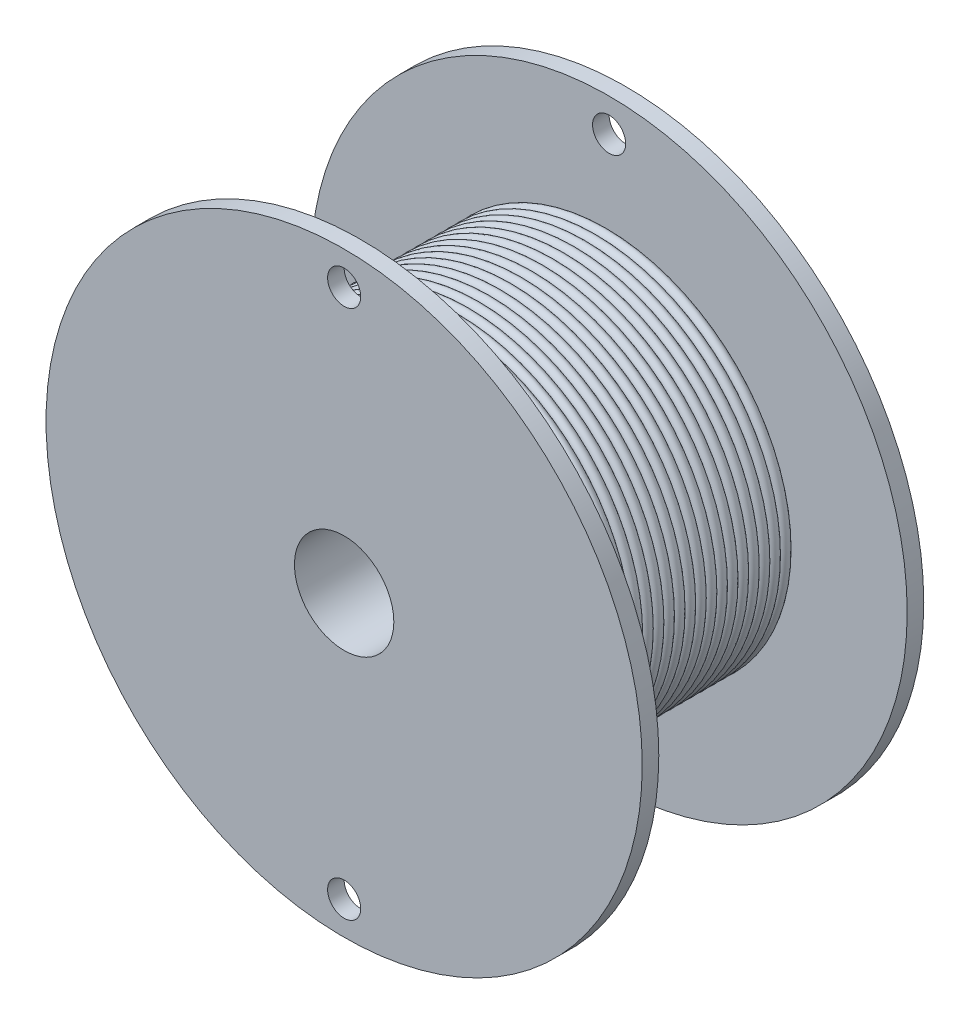
ISO-10303-21;
HEADER;
FILE_DESCRIPTION(('STEP AP214'),'2;1');
FILE_NAME('part.step','',(''),(''),'','','');
FILE_SCHEMA(('AUTOMOTIVE_DESIGN { 1 0 10303 214 1 1 1 1 }'));
ENDSEC;
DATA;
#1=APPLICATION_CONTEXT('core data for automotive mechanical design processes');
#2=APPLICATION_PROTOCOL_DEFINITION('international standard','automotive_design',2000,#1);
#3=PRODUCT_CONTEXT('',#1,'mechanical');
#4=PRODUCT('Part','Part','',(#3));
#5=PRODUCT_RELATED_PRODUCT_CATEGORY('part','',(#4));
#6=PRODUCT_DEFINITION_FORMATION('','',#4);
#7=PRODUCT_DEFINITION_CONTEXT('part definition',#1,'design');
#8=PRODUCT_DEFINITION('design','',#6,#7);
#9=PRODUCT_DEFINITION_SHAPE('','',#8);
#10=(LENGTH_UNIT() NAMED_UNIT(*) SI_UNIT(.MILLI.,.METRE.));
#11=(NAMED_UNIT(*) PLANE_ANGLE_UNIT() SI_UNIT($,.RADIAN.));
#12=(NAMED_UNIT(*) SI_UNIT($,.STERADIAN.) SOLID_ANGLE_UNIT());
#13=UNCERTAINTY_MEASURE_WITH_UNIT(LENGTH_MEASURE(1.E-05),#10,'distance_accuracy_value','');
#14=(GEOMETRIC_REPRESENTATION_CONTEXT(3) GLOBAL_UNCERTAINTY_ASSIGNED_CONTEXT((#13)) GLOBAL_UNIT_ASSIGNED_CONTEXT((#10,
#11,#12)) REPRESENTATION_CONTEXT('',''));
#15=CARTESIAN_POINT('',(0.,0.,0.));
#16=DIRECTION('',(0.,0.,1.));
#17=DIRECTION('',(1.,0.,0.));
#18=AXIS2_PLACEMENT_3D('',#15,#16,#17);
#19=CARTESIAN_POINT('',(0.,0.,-72.9302989836355));
#20=DIRECTION('',(0.,0.,-1.));
#21=DIRECTION('',(-1.,0.,0.));
#22=AXIS2_PLACEMENT_3D('',#19,#20,#21);
#23=TOROIDAL_SURFACE('',#22,54.8417985390266,1.53215312717876);
#24=CARTESIAN_POINT('',(-56.3739516662053,0.,-72.9302989836355));
#25=VERTEX_POINT('',#24);
#26=VERTEX_LOOP('',#25);
#27=FACE_BOUND('',#26,.T.);
#28=ADVANCED_FACE('F39',(#27),#23,.T.);
#29=CLOSED_SHELL('',(#28));
#30=MANIFOLD_SOLID_BREP('B2',#29);
#31=CARTESIAN_POINT('',(0.,0.,-69.7302989836355));
#32=DIRECTION('',(0.,0.,-1.));
#33=DIRECTION('',(-1.,0.,0.));
#34=AXIS2_PLACEMENT_3D('',#31,#32,#33);
#35=TOROIDAL_SURFACE('',#34,54.8417985390266,1.53215312717876);
#36=CARTESIAN_POINT('',(-56.3739516662053,0.,-69.7302989836355));
#37=VERTEX_POINT('',#36);
#38=VERTEX_LOOP('',#37);
#39=FACE_BOUND('',#38,.T.);
#40=ADVANCED_FACE('F57',(#39),#35,.T.);
#41=CLOSED_SHELL('',(#40));
#42=MANIFOLD_SOLID_BREP('B6',#41);
#43=CARTESIAN_POINT('',(0.,0.,-66.5302989836355));
#44=DIRECTION('',(0.,0.,-1.));
#45=DIRECTION('',(-1.,0.,0.));
#46=AXIS2_PLACEMENT_3D('',#43,#44,#45);
#47=TOROIDAL_SURFACE('',#46,54.8417985390266,1.53215312717876);
#48=CARTESIAN_POINT('',(-56.3739516662053,0.,-66.5302989836355));
#49=VERTEX_POINT('',#48);
#50=VERTEX_LOOP('',#49);
#51=FACE_BOUND('',#50,.T.);
#52=ADVANCED_FACE('F75',(#51),#47,.T.);
#53=CLOSED_SHELL('',(#52));
#54=MANIFOLD_SOLID_BREP('B35',#53);
#55=CARTESIAN_POINT('',(0.,0.,-63.3302989836355));
#56=DIRECTION('',(0.,0.,-1.));
#57=DIRECTION('',(-1.,0.,0.));
#58=AXIS2_PLACEMENT_3D('',#55,#56,#57);
#59=TOROIDAL_SURFACE('',#58,54.8417985390266,1.53215312717876);
#60=CARTESIAN_POINT('',(-56.3739516662053,0.,-63.3302989836355));
#61=VERTEX_POINT('',#60);
#62=VERTEX_LOOP('',#61);
#63=FACE_BOUND('',#62,.T.);
#64=ADVANCED_FACE('F93',(#63),#59,.T.);
#65=CLOSED_SHELL('',(#64));
#66=MANIFOLD_SOLID_BREP('B53',#65);
#67=CARTESIAN_POINT('',(0.,0.,-60.1302989836355));
#68=DIRECTION('',(0.,0.,-1.));
#69=DIRECTION('',(-1.,0.,0.));
#70=AXIS2_PLACEMENT_3D('',#67,#68,#69);
#71=TOROIDAL_SURFACE('',#70,54.8417985390266,1.53215312717877);
#72=CARTESIAN_POINT('',(-56.3739516662053,0.,-60.1302989836355));
#73=VERTEX_POINT('',#72);
#74=VERTEX_LOOP('',#73);
#75=FACE_BOUND('',#74,.T.);
#76=ADVANCED_FACE('F111',(#75),#71,.T.);
#77=CLOSED_SHELL('',(#76));
#78=MANIFOLD_SOLID_BREP('B71',#77);
#79=CARTESIAN_POINT('',(0.,0.,-56.9302989836355));
#80=DIRECTION('',(0.,0.,-1.));
#81=DIRECTION('',(-1.,0.,0.));
#82=AXIS2_PLACEMENT_3D('',#79,#80,#81);
#83=TOROIDAL_SURFACE('',#82,54.8417985390266,1.53215312717877);
#84=CARTESIAN_POINT('',(-56.3739516662053,0.,-56.9302989836355));
#85=VERTEX_POINT('',#84);
#86=VERTEX_LOOP('',#85);
#87=FACE_BOUND('',#86,.T.);
#88=ADVANCED_FACE('F129',(#87),#83,.T.);
#89=CLOSED_SHELL('',(#88));
#90=MANIFOLD_SOLID_BREP('B89',#89);
#91=CARTESIAN_POINT('',(0.,0.,-53.7302989836355));
#92=DIRECTION('',(0.,0.,-1.));
#93=DIRECTION('',(-1.,0.,0.));
#94=AXIS2_PLACEMENT_3D('',#91,#92,#93);
#95=TOROIDAL_SURFACE('',#94,54.8417985390266,1.53215312717877);
#96=CARTESIAN_POINT('',(-56.3739516662053,0.,-53.7302989836355));
#97=VERTEX_POINT('',#96);
#98=VERTEX_LOOP('',#97);
#99=FACE_BOUND('',#98,.T.);
#100=ADVANCED_FACE('F147',(#99),#95,.T.);
#101=CLOSED_SHELL('',(#100));
#102=MANIFOLD_SOLID_BREP('B107',#101);
#103=CARTESIAN_POINT('',(0.,0.,-50.5302989836355));
#104=DIRECTION('',(0.,0.,-1.));
#105=DIRECTION('',(-1.,0.,0.));
#106=AXIS2_PLACEMENT_3D('',#103,#104,#105);
#107=TOROIDAL_SURFACE('',#106,54.8417985390266,1.53215312717877);
#108=CARTESIAN_POINT('',(-56.3739516662053,0.,-50.5302989836355));
#109=VERTEX_POINT('',#108);
#110=VERTEX_LOOP('',#109);
#111=FACE_BOUND('',#110,.T.);
#112=ADVANCED_FACE('F165',(#111),#107,.T.);
#113=CLOSED_SHELL('',(#112));
#114=MANIFOLD_SOLID_BREP('B125',#113);
#115=CARTESIAN_POINT('',(0.,0.,-47.3302989836355));
#116=DIRECTION('',(0.,0.,-1.));
#117=DIRECTION('',(-1.,0.,0.));
#118=AXIS2_PLACEMENT_3D('',#115,#116,#117);
#119=TOROIDAL_SURFACE('',#118,54.8417985390266,1.53215312717877);
#120=CARTESIAN_POINT('',(-56.3739516662053,0.,-47.3302989836355));
#121=VERTEX_POINT('',#120);
#122=VERTEX_LOOP('',#121);
#123=FACE_BOUND('',#122,.T.);
#124=ADVANCED_FACE('F183',(#123),#119,.T.);
#125=CLOSED_SHELL('',(#124));
#126=MANIFOLD_SOLID_BREP('B143',#125);
#127=CARTESIAN_POINT('',(0.,0.,-44.1302989836355));
#128=DIRECTION('',(0.,0.,-1.));
#129=DIRECTION('',(-1.,0.,0.));
#130=AXIS2_PLACEMENT_3D('',#127,#128,#129);
#131=TOROIDAL_SURFACE('',#130,54.8417985390266,1.53215312717877);
#132=CARTESIAN_POINT('',(-56.3739516662053,0.,-44.1302989836355));
#133=VERTEX_POINT('',#132);
#134=VERTEX_LOOP('',#133);
#135=FACE_BOUND('',#134,.T.);
#136=ADVANCED_FACE('F201',(#135),#131,.T.);
#137=CLOSED_SHELL('',(#136));
#138=MANIFOLD_SOLID_BREP('B161',#137);
#139=CARTESIAN_POINT('',(0.,0.,-40.9302989836355));
#140=DIRECTION('',(0.,0.,-1.));
#141=DIRECTION('',(-1.,0.,0.));
#142=AXIS2_PLACEMENT_3D('',#139,#140,#141);
#143=TOROIDAL_SURFACE('',#142,54.8417985390266,1.53215312717877);
#144=CARTESIAN_POINT('',(-56.3739516662053,0.,-40.9302989836355));
#145=VERTEX_POINT('',#144);
#146=VERTEX_LOOP('',#145);
#147=FACE_BOUND('',#146,.T.);
#148=ADVANCED_FACE('F219',(#147),#143,.T.);
#149=CLOSED_SHELL('',(#148));
#150=MANIFOLD_SOLID_BREP('B179',#149);
#151=CARTESIAN_POINT('',(0.,0.,-37.7302989836355));
#152=DIRECTION('',(0.,0.,-1.));
#153=DIRECTION('',(-1.,0.,0.));
#154=AXIS2_PLACEMENT_3D('',#151,#152,#153);
#155=TOROIDAL_SURFACE('',#154,54.8417985390266,1.53215312717877);
#156=CARTESIAN_POINT('',(-56.3739516662053,0.,-37.7302989836355));
#157=VERTEX_POINT('',#156);
#158=VERTEX_LOOP('',#157);
#159=FACE_BOUND('',#158,.T.);
#160=ADVANCED_FACE('F237',(#159),#155,.T.);
#161=CLOSED_SHELL('',(#160));
#162=MANIFOLD_SOLID_BREP('B197',#161);
#163=CARTESIAN_POINT('',(0.,0.,-34.5302989836355));
#164=DIRECTION('',(0.,0.,-1.));
#165=DIRECTION('',(-1.,0.,0.));
#166=AXIS2_PLACEMENT_3D('',#163,#164,#165);
#167=TOROIDAL_SURFACE('',#166,54.8417985390266,1.53215312717877);
#168=CARTESIAN_POINT('',(-56.3739516662053,0.,-34.5302989836355));
#169=VERTEX_POINT('',#168);
#170=VERTEX_LOOP('',#169);
#171=FACE_BOUND('',#170,.T.);
#172=ADVANCED_FACE('F255',(#171),#167,.T.);
#173=CLOSED_SHELL('',(#172));
#174=MANIFOLD_SOLID_BREP('B215',#173);
#175=CARTESIAN_POINT('',(0.,0.,-31.3302989836355));
#176=DIRECTION('',(0.,0.,-1.));
#177=DIRECTION('',(-1.,0.,0.));
#178=AXIS2_PLACEMENT_3D('',#175,#176,#177);
#179=TOROIDAL_SURFACE('',#178,54.8417985390266,1.53215312717876);
#180=CARTESIAN_POINT('',(-56.3739516662053,0.,-31.3302989836355));
#181=VERTEX_POINT('',#180);
#182=VERTEX_LOOP('',#181);
#183=FACE_BOUND('',#182,.T.);
#184=ADVANCED_FACE('F273',(#183),#179,.T.);
#185=CLOSED_SHELL('',(#184));
#186=MANIFOLD_SOLID_BREP('B233',#185);
#187=CARTESIAN_POINT('',(0.,0.,-28.1302989836355));
#188=DIRECTION('',(0.,0.,-1.));
#189=DIRECTION('',(-1.,0.,0.));
#190=AXIS2_PLACEMENT_3D('',#187,#188,#189);
#191=TOROIDAL_SURFACE('',#190,54.8417985390266,1.53215312717876);
#192=CARTESIAN_POINT('',(-56.3739516662053,0.,-28.1302989836355));
#193=VERTEX_POINT('',#192);
#194=VERTEX_LOOP('',#193);
#195=FACE_BOUND('',#194,.T.);
#196=ADVANCED_FACE('F291',(#195),#191,.T.);
#197=CLOSED_SHELL('',(#196));
#198=MANIFOLD_SOLID_BREP('B251',#197);
#199=CARTESIAN_POINT('',(0.,0.,-24.9302989836355));
#200=DIRECTION('',(0.,0.,-1.));
#201=DIRECTION('',(-1.,0.,0.));
#202=AXIS2_PLACEMENT_3D('',#199,#200,#201);
#203=TOROIDAL_SURFACE('',#202,54.8417985390266,1.53215312717876);
#204=CARTESIAN_POINT('',(-56.3739516662053,0.,-24.9302989836355));
#205=VERTEX_POINT('',#204);
#206=VERTEX_LOOP('',#205);
#207=FACE_BOUND('',#206,.T.);
#208=ADVANCED_FACE('F309',(#207),#203,.T.);
#209=CLOSED_SHELL('',(#208));
#210=MANIFOLD_SOLID_BREP('B269',#209);
#211=CARTESIAN_POINT('',(0.,0.,-21.7302989836355));
#212=DIRECTION('',(0.,0.,-1.));
#213=DIRECTION('',(-1.,0.,0.));
#214=AXIS2_PLACEMENT_3D('',#211,#212,#213);
#215=TOROIDAL_SURFACE('',#214,54.8417985390266,1.53215312717877);
#216=CARTESIAN_POINT('',(-56.3739516662053,0.,-21.7302989836355));
#217=VERTEX_POINT('',#216);
#218=VERTEX_LOOP('',#217);
#219=FACE_BOUND('',#218,.T.);
#220=ADVANCED_FACE('F327',(#219),#215,.T.);
#221=CLOSED_SHELL('',(#220));
#222=MANIFOLD_SOLID_BREP('B287',#221);
#223=CARTESIAN_POINT('',(0.,0.,-18.5302989836355));
#224=DIRECTION('',(0.,0.,-1.));
#225=DIRECTION('',(-1.,0.,0.));
#226=AXIS2_PLACEMENT_3D('',#223,#224,#225);
#227=TOROIDAL_SURFACE('',#226,54.8417985390266,1.53215312717877);
#228=CARTESIAN_POINT('',(-56.3739516662053,0.,-18.5302989836355));
#229=VERTEX_POINT('',#228);
#230=VERTEX_LOOP('',#229);
#231=FACE_BOUND('',#230,.T.);
#232=ADVANCED_FACE('F345',(#231),#227,.T.);
#233=CLOSED_SHELL('',(#232));
#234=MANIFOLD_SOLID_BREP('B305',#233);
#235=CARTESIAN_POINT('',(0.,0.,-15.3302989836355));
#236=DIRECTION('',(0.,0.,-1.));
#237=DIRECTION('',(-1.,0.,0.));
#238=AXIS2_PLACEMENT_3D('',#235,#236,#237);
#239=TOROIDAL_SURFACE('',#238,54.8417985390266,1.53215312717876);
#240=CARTESIAN_POINT('',(-56.3739516662053,0.,-15.3302989836355));
#241=VERTEX_POINT('',#240);
#242=VERTEX_LOOP('',#241);
#243=FACE_BOUND('',#242,.T.);
#244=ADVANCED_FACE('F363',(#243),#239,.T.);
#245=CLOSED_SHELL('',(#244));
#246=MANIFOLD_SOLID_BREP('B323',#245);
#247=CARTESIAN_POINT('',(0.,0.,-12.1302989836355));
#248=DIRECTION('',(0.,0.,-1.));
#249=DIRECTION('',(-1.,0.,0.));
#250=AXIS2_PLACEMENT_3D('',#247,#248,#249);
#251=TOROIDAL_SURFACE('',#250,54.8417985390266,1.53215312717876);
#252=CARTESIAN_POINT('',(-56.3739516662053,0.,-12.1302989836355));
#253=VERTEX_POINT('',#252);
#254=VERTEX_LOOP('',#253);
#255=FACE_BOUND('',#254,.T.);
#256=ADVANCED_FACE('F381',(#255),#251,.T.);
#257=CLOSED_SHELL('',(#256));
#258=MANIFOLD_SOLID_BREP('B341',#257);
#259=CARTESIAN_POINT('',(0.,0.,-8.93029898363548));
#260=DIRECTION('',(0.,0.,-1.));
#261=DIRECTION('',(-1.,0.,0.));
#262=AXIS2_PLACEMENT_3D('',#259,#260,#261);
#263=TOROIDAL_SURFACE('',#262,54.8417985390266,1.53215312717877);
#264=CARTESIAN_POINT('',(-56.3739516662053,0.,-8.93029898363548));
#265=VERTEX_POINT('',#264);
#266=VERTEX_LOOP('',#265);
#267=FACE_BOUND('',#266,.T.);
#268=ADVANCED_FACE('F399',(#267),#263,.T.);
#269=CLOSED_SHELL('',(#268));
#270=MANIFOLD_SOLID_BREP('B359',#269);
#271=CARTESIAN_POINT('',(0.,0.,-5.73029898363548));
#272=DIRECTION('',(0.,0.,-1.));
#273=DIRECTION('',(-1.,0.,0.));
#274=AXIS2_PLACEMENT_3D('',#271,#272,#273);
#275=TOROIDAL_SURFACE('',#274,54.8417985390266,1.53215312717876);
#276=CARTESIAN_POINT('',(-56.3739516662053,0.,-5.73029898363548));
#277=VERTEX_POINT('',#276);
#278=VERTEX_LOOP('',#277);
#279=FACE_BOUND('',#278,.T.);
#280=ADVANCED_FACE('F417',(#279),#275,.T.);
#281=CLOSED_SHELL('',(#280));
#282=MANIFOLD_SOLID_BREP('B377',#281);
#283=CARTESIAN_POINT('',(0.,0.,-2.53029898363548));
#284=DIRECTION('',(0.,0.,-1.));
#285=DIRECTION('',(-1.,0.,0.));
#286=AXIS2_PLACEMENT_3D('',#283,#284,#285);
#287=TOROIDAL_SURFACE('',#286,54.8417985390266,1.53215312717876);
#288=CARTESIAN_POINT('',(-56.3739516662053,0.,-2.53029898363548));
#289=VERTEX_POINT('',#288);
#290=VERTEX_LOOP('',#289);
#291=FACE_BOUND('',#290,.T.);
#292=ADVANCED_FACE('F436',(#291),#287,.T.);
#293=CLOSED_SHELL('',(#292));
#294=MANIFOLD_SOLID_BREP('B395',#293);
#295=CARTESIAN_POINT('',(0.,0.,0.));
#296=DIRECTION('',(0.,0.,1.));
#297=DIRECTION('',(1.,0.,0.));
#298=AXIS2_PLACEMENT_3D('',#295,#296,#297);
#299=PLANE('',#298);
#300=CARTESIAN_POINT('',(0.,80.,0.));
#301=DIRECTION('',(0.,0.,1.));
#302=DIRECTION('',(1.,0.,0.));
#303=AXIS2_PLACEMENT_3D('',#300,#301,#302);
#304=CIRCLE('',#303,5.);
#305=CARTESIAN_POINT('',(5.,80.,0.));
#306=VERTEX_POINT('',#305);
#307=EDGE_CURVE('E469',#306,#306,#304,.T.);
#308=ORIENTED_EDGE('',*,*,#307,.T.);
#309=EDGE_LOOP('',(#308));
#310=FACE_BOUND('',#309,.T.);
#311=CARTESIAN_POINT('',(0.,-80.,0.));
#312=DIRECTION('',(0.,0.,1.));
#313=DIRECTION('',(1.,0.,0.));
#314=AXIS2_PLACEMENT_3D('',#311,#312,#313);
#315=CIRCLE('',#314,5.);
#316=CARTESIAN_POINT('',(5.00000000000002,-80.,0.));
#317=VERTEX_POINT('',#316);
#318=EDGE_CURVE('E477',#317,#317,#315,.T.);
#319=ORIENTED_EDGE('',*,*,#318,.T.);
#320=EDGE_LOOP('',(#319));
#321=FACE_BOUND('',#320,.T.);
#322=CARTESIAN_POINT('',(0.,0.,0.));
#323=DIRECTION('',(0.,0.,1.));
#324=DIRECTION('',(1.,0.,0.));
#325=AXIS2_PLACEMENT_3D('',#322,#323,#324);
#326=CIRCLE('',#325,90.);
#327=CARTESIAN_POINT('',(90.,0.,0.));
#328=VERTEX_POINT('',#327);
#329=EDGE_CURVE('E460',#328,#328,#326,.T.);
#330=ORIENTED_EDGE('',*,*,#329,.F.);
#331=EDGE_LOOP('',(#330));
#332=FACE_BOUND('',#331,.T.);
#333=CARTESIAN_POINT('',(0.,0.,0.));
#334=DIRECTION('',(0.,0.,1.));
#335=DIRECTION('',(1.,0.,0.));
#336=AXIS2_PLACEMENT_3D('',#333,#334,#335);
#337=CIRCLE('',#336,30.);
#338=CARTESIAN_POINT('',(30.,0.,0.));
#339=VERTEX_POINT('',#338);
#340=EDGE_CURVE('E435',#339,#339,#337,.F.);
#341=ORIENTED_EDGE('',*,*,#340,.F.);
#342=EDGE_LOOP('',(#341));
#343=FACE_BOUND('',#342,.T.);
#344=ADVANCED_FACE('F448',(#310,#321,#332,#343),#299,.F.);
#345=CARTESIAN_POINT('',(0.,0.,5.));
#346=DIRECTION('',(0.,0.,-1.));
#347=DIRECTION('',(-1.,0.,0.));
#348=AXIS2_PLACEMENT_3D('',#345,#346,#347);
#349=CYLINDRICAL_SURFACE('',#348,90.);
#350=CARTESIAN_POINT('',(0.,0.,5.));
#351=DIRECTION('',(0.,0.,1.));
#352=DIRECTION('',(1.,0.,0.));
#353=AXIS2_PLACEMENT_3D('',#350,#351,#352);
#354=CIRCLE('',#353,90.);
#355=CARTESIAN_POINT('',(90.,0.,5.));
#356=VERTEX_POINT('',#355);
#357=EDGE_CURVE('E456',#356,#356,#354,.T.);
#358=ORIENTED_EDGE('',*,*,#357,.F.);
#359=EDGE_LOOP('',(#358));
#360=FACE_BOUND('',#359,.T.);
#361=ORIENTED_EDGE('',*,*,#329,.T.);
#362=EDGE_LOOP('',(#361));
#363=FACE_BOUND('',#362,.T.);
#364=ADVANCED_FACE('F450',(#360,#363),#349,.T.);
#365=CARTESIAN_POINT('',(0.,0.,5.));
#366=DIRECTION('',(0.,0.,1.));
#367=DIRECTION('',(1.,0.,0.));
#368=AXIS2_PLACEMENT_3D('',#365,#366,#367);
#369=PLANE('',#368);
#370=CARTESIAN_POINT('',(0.,0.,5.));
#371=DIRECTION('',(0.,0.,1.));
#372=DIRECTION('',(1.,0.,0.));
#373=AXIS2_PLACEMENT_3D('',#370,#371,#372);
#374=CIRCLE('',#373,15.);
#375=CARTESIAN_POINT('',(15.,0.,5.));
#376=VERTEX_POINT('',#375);
#377=EDGE_CURVE('E496',#376,#376,#374,.T.);
#378=ORIENTED_EDGE('',*,*,#377,.F.);
#379=EDGE_LOOP('',(#378));
#380=FACE_BOUND('',#379,.T.);
#381=CARTESIAN_POINT('',(0.,80.,5.));
#382=DIRECTION('',(0.,0.,1.));
#383=DIRECTION('',(1.,0.,0.));
#384=AXIS2_PLACEMENT_3D('',#381,#382,#383);
#385=CIRCLE('',#384,5.);
#386=CARTESIAN_POINT('',(5.,80.,5.));
#387=VERTEX_POINT('',#386);
#388=EDGE_CURVE('E490',#387,#387,#385,.T.);
#389=ORIENTED_EDGE('',*,*,#388,.F.);
#390=EDGE_LOOP('',(#389));
#391=FACE_BOUND('',#390,.T.);
#392=CARTESIAN_POINT('',(0.,-80.,5.));
#393=DIRECTION('',(0.,0.,1.));
#394=DIRECTION('',(1.,0.,0.));
#395=AXIS2_PLACEMENT_3D('',#392,#393,#394);
#396=CIRCLE('',#395,5.);
#397=CARTESIAN_POINT('',(5.00000000000002,-80.,5.));
#398=VERTEX_POINT('',#397);
#399=EDGE_CURVE('E484',#398,#398,#396,.T.);
#400=ORIENTED_EDGE('',*,*,#399,.F.);
#401=EDGE_LOOP('',(#400));
#402=FACE_BOUND('',#401,.T.);
#403=ORIENTED_EDGE('',*,*,#357,.T.);
#404=EDGE_LOOP('',(#403));
#405=FACE_BOUND('',#404,.T.);
#406=ADVANCED_FACE('F513',(#380,#391,#402,#405),#369,.T.);
#407=CARTESIAN_POINT('',(0.,0.,-80.));
#408=DIRECTION('',(0.,0.,1.));
#409=DIRECTION('',(1.,0.,0.));
#410=AXIS2_PLACEMENT_3D('',#407,#408,#409);
#411=CYLINDRICAL_SURFACE('',#410,30.);
#412=CARTESIAN_POINT('',(0.,0.,-75.));
#413=DIRECTION('',(0.,0.,1.));
#414=DIRECTION('',(1.,0.,0.));
#415=AXIS2_PLACEMENT_3D('',#412,#413,#414);
#416=CIRCLE('',#415,30.);
#417=CARTESIAN_POINT('',(30.,0.,-75.));
#418=VERTEX_POINT('',#417);
#419=EDGE_CURVE('E452',#418,#418,#416,.T.);
#420=ORIENTED_EDGE('',*,*,#419,.T.);
#421=EDGE_LOOP('',(#420));
#422=FACE_BOUND('',#421,.T.);
#423=ORIENTED_EDGE('',*,*,#340,.T.);
#424=EDGE_LOOP('',(#423));
#425=FACE_BOUND('',#424,.T.);
#426=ADVANCED_FACE('F516',(#422,#425),#411,.T.);
#427=CARTESIAN_POINT('',(0.,0.,-75.));
#428=DIRECTION('',(0.,0.,1.));
#429=DIRECTION('',(1.,0.,0.));
#430=AXIS2_PLACEMENT_3D('',#427,#428,#429);
#431=PLANE('',#430);
#432=CARTESIAN_POINT('',(0.,80.,-75.));
#433=DIRECTION('',(0.,0.,1.));
#434=DIRECTION('',(1.,0.,0.));
#435=AXIS2_PLACEMENT_3D('',#432,#433,#434);
#436=CIRCLE('',#435,5.);
#437=CARTESIAN_POINT('',(5.,80.,-75.));
#438=VERTEX_POINT('',#437);
#439=EDGE_CURVE('E474',#438,#438,#436,.T.);
#440=ORIENTED_EDGE('',*,*,#439,.F.);
#441=EDGE_LOOP('',(#440));
#442=FACE_BOUND('',#441,.T.);
#443=CARTESIAN_POINT('',(0.,-80.,-75.));
#444=DIRECTION('',(0.,0.,1.));
#445=DIRECTION('',(1.,0.,0.));
#446=AXIS2_PLACEMENT_3D('',#443,#444,#445);
#447=CIRCLE('',#446,5.);
#448=CARTESIAN_POINT('',(5.00000000000002,-80.,-75.));
#449=VERTEX_POINT('',#448);
#450=EDGE_CURVE('E480',#449,#449,#447,.T.);
#451=ORIENTED_EDGE('',*,*,#450,.F.);
#452=EDGE_LOOP('',(#451));
#453=FACE_BOUND('',#452,.T.);
#454=CARTESIAN_POINT('',(0.,0.,-75.));
#455=DIRECTION('',(0.,0.,1.));
#456=DIRECTION('',(1.,0.,0.));
#457=AXIS2_PLACEMENT_3D('',#454,#455,#456);
#458=CIRCLE('',#457,90.);
#459=CARTESIAN_POINT('',(90.,0.,-75.));
#460=VERTEX_POINT('',#459);
#461=EDGE_CURVE('E468',#460,#460,#458,.T.);
#462=ORIENTED_EDGE('',*,*,#461,.T.);
#463=EDGE_LOOP('',(#462));
#464=FACE_BOUND('',#463,.T.);
#465=ORIENTED_EDGE('',*,*,#419,.F.);
#466=EDGE_LOOP('',(#465));
#467=FACE_BOUND('',#466,.T.);
#468=ADVANCED_FACE('F538',(#442,#453,#464,#467),#431,.T.);
#469=CARTESIAN_POINT('',(0.,0.,-75.));
#470=DIRECTION('',(0.,0.,-1.));
#471=DIRECTION('',(-1.,0.,0.));
#472=AXIS2_PLACEMENT_3D('',#469,#470,#471);
#473=CYLINDRICAL_SURFACE('',#472,90.);
#474=ORIENTED_EDGE('',*,*,#461,.F.);
#475=EDGE_LOOP('',(#474));
#476=FACE_BOUND('',#475,.T.);
#477=CARTESIAN_POINT('',(0.,0.,-80.));
#478=DIRECTION('',(0.,0.,1.));
#479=DIRECTION('',(1.,0.,0.));
#480=AXIS2_PLACEMENT_3D('',#477,#478,#479);
#481=CIRCLE('',#480,90.);
#482=CARTESIAN_POINT('',(90.,0.,-80.));
#483=VERTEX_POINT('',#482);
#484=EDGE_CURVE('E465',#483,#483,#481,.T.);
#485=ORIENTED_EDGE('',*,*,#484,.T.);
#486=EDGE_LOOP('',(#485));
#487=FACE_BOUND('',#486,.T.);
#488=ADVANCED_FACE('F543',(#476,#487),#473,.T.);
#489=CARTESIAN_POINT('',(0.,0.,-80.));
#490=DIRECTION('',(0.,0.,-1.));
#491=DIRECTION('',(-1.,0.,0.));
#492=AXIS2_PLACEMENT_3D('',#489,#490,#491);
#493=PLANE('',#492);
#494=CARTESIAN_POINT('',(0.,0.,-80.));
#495=DIRECTION('',(0.,0.,1.));
#496=DIRECTION('',(1.,0.,0.));
#497=AXIS2_PLACEMENT_3D('',#494,#495,#496);
#498=CIRCLE('',#497,15.);
#499=CARTESIAN_POINT('',(15.,0.,-80.));
#500=VERTEX_POINT('',#499);
#501=EDGE_CURVE('E483',#500,#500,#498,.T.);
#502=ORIENTED_EDGE('',*,*,#501,.T.);
#503=EDGE_LOOP('',(#502));
#504=FACE_BOUND('',#503,.T.);
#505=CARTESIAN_POINT('',(0.,80.,-80.));
#506=DIRECTION('',(0.,0.,1.));
#507=DIRECTION('',(1.,0.,0.));
#508=AXIS2_PLACEMENT_3D('',#505,#506,#507);
#509=CIRCLE('',#508,5.);
#510=CARTESIAN_POINT('',(5.,80.,-80.));
#511=VERTEX_POINT('',#510);
#512=EDGE_CURVE('E493',#511,#511,#509,.T.);
#513=ORIENTED_EDGE('',*,*,#512,.T.);
#514=EDGE_LOOP('',(#513));
#515=FACE_BOUND('',#514,.T.);
#516=CARTESIAN_POINT('',(0.,-80.,-80.));
#517=DIRECTION('',(0.,0.,1.));
#518=DIRECTION('',(1.,0.,0.));
#519=AXIS2_PLACEMENT_3D('',#516,#517,#518);
#520=CIRCLE('',#519,5.);
#521=CARTESIAN_POINT('',(5.00000000000002,-80.,-80.));
#522=VERTEX_POINT('',#521);
#523=EDGE_CURVE('E487',#522,#522,#520,.T.);
#524=ORIENTED_EDGE('',*,*,#523,.T.);
#525=EDGE_LOOP('',(#524));
#526=FACE_BOUND('',#525,.T.);
#527=ORIENTED_EDGE('',*,*,#484,.F.);
#528=EDGE_LOOP('',(#527));
#529=FACE_BOUND('',#528,.T.);
#530=ADVANCED_FACE('F502',(#504,#515,#526,#529),#493,.T.);
#531=CARTESIAN_POINT('',(0.,-80.,-80.));
#532=DIRECTION('',(0.,0.,1.));
#533=DIRECTION('',(1.,0.,0.));
#534=AXIS2_PLACEMENT_3D('',#531,#532,#533);
#535=CYLINDRICAL_SURFACE('',#534,5.);
#536=ORIENTED_EDGE('',*,*,#450,.T.);
#537=EDGE_LOOP('',(#536));
#538=FACE_BOUND('',#537,.T.);
#539=ORIENTED_EDGE('',*,*,#523,.F.);
#540=EDGE_LOOP('',(#539));
#541=FACE_BOUND('',#540,.T.);
#542=ADVANCED_FACE('F542',(#538,#541),#535,.F.);
#543=CARTESIAN_POINT('',(0.,80.,-80.));
#544=DIRECTION('',(0.,0.,1.));
#545=DIRECTION('',(1.,0.,0.));
#546=AXIS2_PLACEMENT_3D('',#543,#544,#545);
#547=CYLINDRICAL_SURFACE('',#546,5.);
#548=ORIENTED_EDGE('',*,*,#439,.T.);
#549=EDGE_LOOP('',(#548));
#550=FACE_BOUND('',#549,.T.);
#551=ORIENTED_EDGE('',*,*,#512,.F.);
#552=EDGE_LOOP('',(#551));
#553=FACE_BOUND('',#552,.T.);
#554=ADVANCED_FACE('F509',(#550,#553),#547,.F.);
#555=CARTESIAN_POINT('',(0.,0.,-80.));
#556=DIRECTION('',(0.,0.,1.));
#557=DIRECTION('',(1.,0.,0.));
#558=AXIS2_PLACEMENT_3D('',#555,#556,#557);
#559=CYLINDRICAL_SURFACE('',#558,15.);
#560=ORIENTED_EDGE('',*,*,#501,.F.);
#561=EDGE_LOOP('',(#560));
#562=FACE_BOUND('',#561,.T.);
#563=ORIENTED_EDGE('',*,*,#377,.T.);
#564=EDGE_LOOP('',(#563));
#565=FACE_BOUND('',#564,.T.);
#566=ADVANCED_FACE('F505',(#562,#565),#559,.F.);
#567=ORIENTED_EDGE('',*,*,#399,.T.);
#568=EDGE_LOOP('',(#567));
#569=FACE_BOUND('',#568,.T.);
#570=ORIENTED_EDGE('',*,*,#318,.F.);
#571=EDGE_LOOP('',(#570));
#572=FACE_BOUND('',#571,.T.);
#573=ADVANCED_FACE('F508',(#569,#572),#535,.F.);
#574=ORIENTED_EDGE('',*,*,#388,.T.);
#575=EDGE_LOOP('',(#574));
#576=FACE_BOUND('',#575,.T.);
#577=ORIENTED_EDGE('',*,*,#307,.F.);
#578=EDGE_LOOP('',(#577));
#579=FACE_BOUND('',#578,.T.);
#580=ADVANCED_FACE('F555',(#576,#579),#547,.F.);
#581=CLOSED_SHELL('',(#344,#364,#406,#426,#468,#488,#530,#542,#554,#566,#573,#580));
#582=MANIFOLD_SOLID_BREP('B413',#581);
#583=ADVANCED_BREP_SHAPE_REPRESENTATION('',(#18,#30,#42,#54,#66,#78,#90,#102,#114,#126,#138,
#150,#162,#174,#186,#198,#210,#222,#234,#246,#258,#270,#282,#294,#582),#14);
#584=SHAPE_DEFINITION_REPRESENTATION(#9,#583);
ENDSEC;
END-ISO-10303-21;
